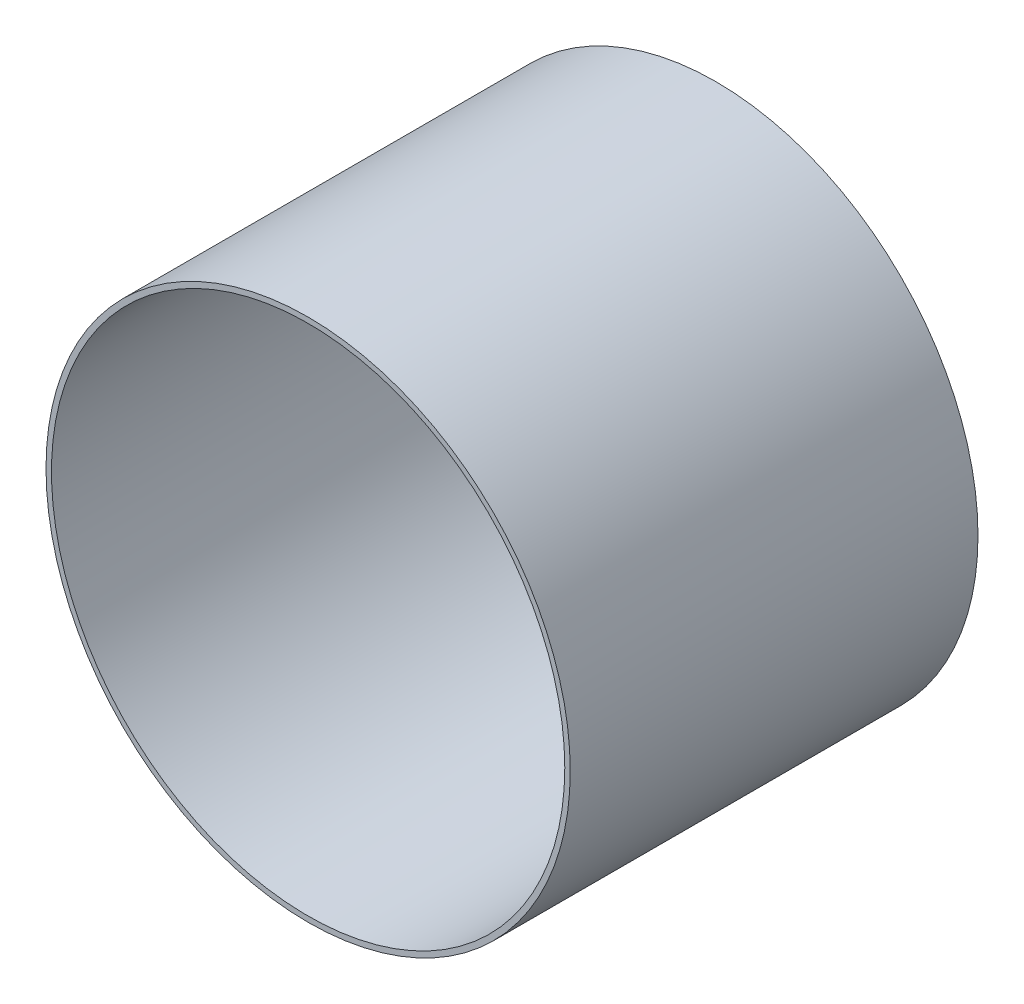
ISO-10303-21;
HEADER;
FILE_DESCRIPTION(('STEP AP214'),'2;1');
FILE_NAME('part.step','',(''),(''),'','','');
FILE_SCHEMA(('AUTOMOTIVE_DESIGN { 1 0 10303 214 1 1 1 1 }'));
ENDSEC;
DATA;
#1=APPLICATION_CONTEXT('core data for automotive mechanical design processes');
#2=APPLICATION_PROTOCOL_DEFINITION('international standard','automotive_design',2000,#1);
#3=PRODUCT_CONTEXT('',#1,'mechanical');
#4=PRODUCT('Part','Part','',(#3));
#5=PRODUCT_RELATED_PRODUCT_CATEGORY('part','',(#4));
#6=PRODUCT_DEFINITION_FORMATION('','',#4);
#7=PRODUCT_DEFINITION_CONTEXT('part definition',#1,'design');
#8=PRODUCT_DEFINITION('design','',#6,#7);
#9=PRODUCT_DEFINITION_SHAPE('','',#8);
#10=(LENGTH_UNIT() NAMED_UNIT(*) SI_UNIT(.MILLI.,.METRE.));
#11=(NAMED_UNIT(*) PLANE_ANGLE_UNIT() SI_UNIT($,.RADIAN.));
#12=(NAMED_UNIT(*) SI_UNIT($,.STERADIAN.) SOLID_ANGLE_UNIT());
#13=UNCERTAINTY_MEASURE_WITH_UNIT(LENGTH_MEASURE(1.E-05),#10,'distance_accuracy_value','');
#14=(GEOMETRIC_REPRESENTATION_CONTEXT(3) GLOBAL_UNCERTAINTY_ASSIGNED_CONTEXT((#13)) GLOBAL_UNIT_ASSIGNED_CONTEXT((#10,
#11,#12)) REPRESENTATION_CONTEXT('',''));
#15=CARTESIAN_POINT('',(0.,0.,0.));
#16=DIRECTION('',(0.,0.,1.));
#17=DIRECTION('',(1.,0.,0.));
#18=AXIS2_PLACEMENT_3D('',#15,#16,#17);
#19=CARTESIAN_POINT('',(49.9721701815575,129.231293468305,56.));
#20=DIRECTION('',(0.,0.,1.));
#21=DIRECTION('',(1.,0.,0.));
#22=AXIS2_PLACEMENT_3D('',#19,#20,#21);
#23=PLANE('',#22);
#24=CARTESIAN_POINT('',(49.9721701815575,129.231293468305,56.));
#25=DIRECTION('',(0.,0.,1.));
#26=DIRECTION('',(1.,0.,0.));
#27=AXIS2_PLACEMENT_3D('',#24,#25,#26);
#28=CIRCLE('',#27,36.);
#29=CARTESIAN_POINT('',(85.9721701815575,129.231293468305,56.));
#30=VERTEX_POINT('',#29);
#31=EDGE_CURVE('E10',#30,#30,#28,.T.);
#32=ORIENTED_EDGE('',*,*,#31,.T.);
#33=EDGE_LOOP('',(#32));
#34=FACE_BOUND('',#33,.T.);
#35=CARTESIAN_POINT('',(49.9721701815575,129.231293468305,56.));
#36=DIRECTION('',(0.,0.,1.));
#37=DIRECTION('',(1.,0.,0.));
#38=AXIS2_PLACEMENT_3D('',#35,#36,#37);
#39=CIRCLE('',#38,35.25);
#40=CARTESIAN_POINT('',(85.2221701815575,129.231293468305,56.));
#41=VERTEX_POINT('',#40);
#42=EDGE_CURVE('E48',#41,#41,#39,.T.);
#43=ORIENTED_EDGE('',*,*,#42,.F.);
#44=EDGE_LOOP('',(#43));
#45=FACE_BOUND('',#44,.T.);
#46=ADVANCED_FACE('F37',(#34,#45),#23,.T.);
#47=CARTESIAN_POINT('',(49.9721701815575,129.231293468305,0.));
#48=DIRECTION('',(0.,0.,1.));
#49=DIRECTION('',(1.,0.,0.));
#50=AXIS2_PLACEMENT_3D('',#47,#48,#49);
#51=PLANE('',#50);
#52=CARTESIAN_POINT('',(49.9721701815575,129.231293468305,0.));
#53=DIRECTION('',(0.,0.,1.));
#54=DIRECTION('',(1.,0.,0.));
#55=AXIS2_PLACEMENT_3D('',#52,#53,#54);
#56=CIRCLE('',#55,36.);
#57=CARTESIAN_POINT('',(85.9721701815575,129.231293468305,0.));
#58=VERTEX_POINT('',#57);
#59=EDGE_CURVE('E41',#58,#58,#56,.T.);
#60=ORIENTED_EDGE('',*,*,#59,.F.);
#61=EDGE_LOOP('',(#60));
#62=FACE_BOUND('',#61,.T.);
#63=CARTESIAN_POINT('',(49.9721701815575,129.231293468305,0.));
#64=DIRECTION('',(0.,0.,1.));
#65=DIRECTION('',(1.,0.,0.));
#66=AXIS2_PLACEMENT_3D('',#63,#64,#65);
#67=CIRCLE('',#66,35.25);
#68=CARTESIAN_POINT('',(85.2221701815575,129.231293468305,0.));
#69=VERTEX_POINT('',#68);
#70=EDGE_CURVE('E50',#69,#69,#67,.T.);
#71=ORIENTED_EDGE('',*,*,#70,.T.);
#72=EDGE_LOOP('',(#71));
#73=FACE_BOUND('',#72,.T.);
#74=ADVANCED_FACE('F60',(#62,#73),#51,.F.);
#75=CARTESIAN_POINT('',(49.9721701815575,129.231293468305,56.));
#76=DIRECTION('',(0.,0.,-1.));
#77=DIRECTION('',(-1.,0.,0.));
#78=AXIS2_PLACEMENT_3D('',#75,#76,#77);
#79=CYLINDRICAL_SURFACE('',#78,36.);
#80=ORIENTED_EDGE('',*,*,#31,.F.);
#81=EDGE_LOOP('',(#80));
#82=FACE_BOUND('',#81,.T.);
#83=ORIENTED_EDGE('',*,*,#59,.T.);
#84=EDGE_LOOP('',(#83));
#85=FACE_BOUND('',#84,.T.);
#86=ADVANCED_FACE('F39',(#82,#85),#79,.T.);
#87=CARTESIAN_POINT('',(49.9721701815575,129.231293468305,56.));
#88=DIRECTION('',(0.,0.,-1.));
#89=DIRECTION('',(-1.,0.,0.));
#90=AXIS2_PLACEMENT_3D('',#87,#88,#89);
#91=CYLINDRICAL_SURFACE('',#90,35.25);
#92=ORIENTED_EDGE('',*,*,#42,.T.);
#93=EDGE_LOOP('',(#92));
#94=FACE_BOUND('',#93,.T.);
#95=ORIENTED_EDGE('',*,*,#70,.F.);
#96=EDGE_LOOP('',(#95));
#97=FACE_BOUND('',#96,.T.);
#98=ADVANCED_FACE('F56',(#94,#97),#91,.F.);
#99=CLOSED_SHELL('',(#46,#74,#86,#98));
#100=MANIFOLD_SOLID_BREP('B2',#99);
#101=ADVANCED_BREP_SHAPE_REPRESENTATION('',(#18,#100),#14);
#102=SHAPE_DEFINITION_REPRESENTATION(#9,#101);
ENDSEC;
END-ISO-10303-21;
